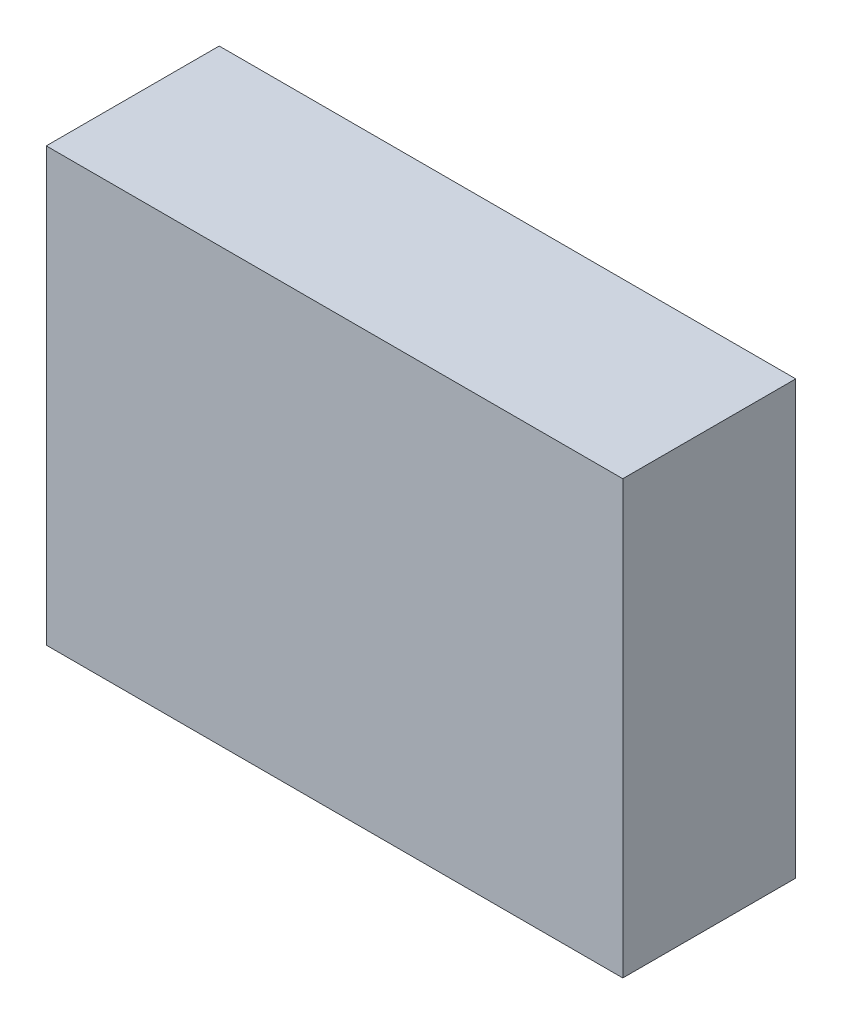
ISO-10303-21;
HEADER;
FILE_DESCRIPTION(('STEP AP214'),'2;1');
FILE_NAME('part.step','',(''),(''),'','','');
FILE_SCHEMA(('AUTOMOTIVE_DESIGN { 1 0 10303 214 1 1 1 1 }'));
ENDSEC;
DATA;
#1=APPLICATION_CONTEXT('core data for automotive mechanical design processes');
#2=APPLICATION_PROTOCOL_DEFINITION('international standard','automotive_design',2000,#1);
#3=PRODUCT_CONTEXT('',#1,'mechanical');
#4=PRODUCT('Part','Part','',(#3));
#5=PRODUCT_RELATED_PRODUCT_CATEGORY('part','',(#4));
#6=PRODUCT_DEFINITION_FORMATION('','',#4);
#7=PRODUCT_DEFINITION_CONTEXT('part definition',#1,'design');
#8=PRODUCT_DEFINITION('design','',#6,#7);
#9=PRODUCT_DEFINITION_SHAPE('','',#8);
#10=(LENGTH_UNIT() NAMED_UNIT(*) SI_UNIT(.MILLI.,.METRE.));
#11=(NAMED_UNIT(*) PLANE_ANGLE_UNIT() SI_UNIT($,.RADIAN.));
#12=(NAMED_UNIT(*) SI_UNIT($,.STERADIAN.) SOLID_ANGLE_UNIT());
#13=UNCERTAINTY_MEASURE_WITH_UNIT(LENGTH_MEASURE(1.E-05),#10,'distance_accuracy_value','');
#14=(GEOMETRIC_REPRESENTATION_CONTEXT(3) GLOBAL_UNCERTAINTY_ASSIGNED_CONTEXT((#13)) GLOBAL_UNIT_ASSIGNED_CONTEXT((#10,
#11,#12)) REPRESENTATION_CONTEXT('',''));
#15=CARTESIAN_POINT('',(0.,0.,0.));
#16=DIRECTION('',(0.,0.,1.));
#17=DIRECTION('',(1.,0.,0.));
#18=AXIS2_PLACEMENT_3D('',#15,#16,#17);
#19=CARTESIAN_POINT('',(9.99999999999999,7.5,3.));
#20=DIRECTION('',(-1.,0.,0.));
#21=DIRECTION('',(0.,-1.,0.));
#22=AXIS2_PLACEMENT_3D('',#19,#20,#21);
#23=PLANE('',#22);
#24=DIRECTION('',(0.,1.,0.));
#25=VECTOR('',#24,1.);
#26=CARTESIAN_POINT('',(9.99999999999999,7.5,-3.));
#27=LINE('',#26,#25);
#28=CARTESIAN_POINT('',(10.,-7.5,-3.));
#29=VERTEX_POINT('',#28);
#30=CARTESIAN_POINT('',(9.99999999999999,7.5,-3.));
#31=VERTEX_POINT('',#30);
#32=EDGE_CURVE('E100',#29,#31,#27,.T.);
#33=ORIENTED_EDGE('',*,*,#32,.T.);
#34=DIRECTION('',(0.,0.,-1.));
#35=VECTOR('',#34,1.);
#36=CARTESIAN_POINT('',(9.99999999999999,7.5,3.));
#37=LINE('',#36,#35);
#38=CARTESIAN_POINT('',(9.99999999999999,7.5,3.));
#39=VERTEX_POINT('',#38);
#40=EDGE_CURVE('E11',#39,#31,#37,.T.);
#41=ORIENTED_EDGE('',*,*,#40,.F.);
#42=DIRECTION('',(0.,1.,0.));
#43=VECTOR('',#42,1.);
#44=CARTESIAN_POINT('',(9.99999999999999,7.5,3.));
#45=LINE('',#44,#43);
#46=CARTESIAN_POINT('',(10.,-7.5,3.));
#47=VERTEX_POINT('',#46);
#48=EDGE_CURVE('E88',#47,#39,#45,.T.);
#49=ORIENTED_EDGE('',*,*,#48,.F.);
#50=DIRECTION('',(0.,0.,-1.));
#51=VECTOR('',#50,1.);
#52=CARTESIAN_POINT('',(10.,-7.5,3.));
#53=LINE('',#52,#51);
#54=EDGE_CURVE('E96',#47,#29,#53,.T.);
#55=ORIENTED_EDGE('',*,*,#54,.T.);
#56=EDGE_LOOP('',(#33,#41,#49,#55));
#57=FACE_BOUND('',#56,.T.);
#58=ADVANCED_FACE('F37',(#57),#23,.F.);
#59=CARTESIAN_POINT('',(-10.,7.5,3.));
#60=DIRECTION('',(0.,-1.,0.));
#61=DIRECTION('',(0.,0.,-1.));
#62=AXIS2_PLACEMENT_3D('',#59,#60,#61);
#63=PLANE('',#62);
#64=DIRECTION('',(-1.,0.,0.));
#65=VECTOR('',#64,1.);
#66=CARTESIAN_POINT('',(-10.,7.5,-3.));
#67=LINE('',#66,#65);
#68=CARTESIAN_POINT('',(-10.,7.5,-3.));
#69=VERTEX_POINT('',#68);
#70=EDGE_CURVE('E92',#31,#69,#67,.T.);
#71=ORIENTED_EDGE('',*,*,#70,.T.);
#72=DIRECTION('',(0.,0.,-1.));
#73=VECTOR('',#72,1.);
#74=CARTESIAN_POINT('',(-10.,7.5,3.));
#75=LINE('',#74,#73);
#76=CARTESIAN_POINT('',(-10.,7.5,3.));
#77=VERTEX_POINT('',#76);
#78=EDGE_CURVE('E45',#77,#69,#75,.T.);
#79=ORIENTED_EDGE('',*,*,#78,.F.);
#80=DIRECTION('',(-1.,0.,0.));
#81=VECTOR('',#80,1.);
#82=CARTESIAN_POINT('',(-10.,7.5,3.));
#83=LINE('',#82,#81);
#84=EDGE_CURVE('E83',#39,#77,#83,.T.);
#85=ORIENTED_EDGE('',*,*,#84,.F.);
#86=ORIENTED_EDGE('',*,*,#40,.T.);
#87=EDGE_LOOP('',(#71,#79,#85,#86));
#88=FACE_BOUND('',#87,.T.);
#89=ADVANCED_FACE('F91',(#88),#63,.F.);
#90=CARTESIAN_POINT('',(-10.,7.5,3.));
#91=DIRECTION('',(1.,0.,0.));
#92=DIRECTION('',(0.,0.,-1.));
#93=AXIS2_PLACEMENT_3D('',#90,#91,#92);
#94=PLANE('',#93);
#95=DIRECTION('',(0.,-1.,0.));
#96=VECTOR('',#95,1.);
#97=CARTESIAN_POINT('',(-10.,7.5,-3.));
#98=LINE('',#97,#96);
#99=CARTESIAN_POINT('',(-10.,-7.5,-3.));
#100=VERTEX_POINT('',#99);
#101=EDGE_CURVE('E70',#69,#100,#98,.T.);
#102=ORIENTED_EDGE('',*,*,#101,.T.);
#103=DIRECTION('',(0.,0.,-1.));
#104=VECTOR('',#103,1.);
#105=CARTESIAN_POINT('',(-10.,-7.5,3.));
#106=LINE('',#105,#104);
#107=CARTESIAN_POINT('',(-10.,-7.5,3.));
#108=VERTEX_POINT('',#107);
#109=EDGE_CURVE('E93',#108,#100,#106,.T.);
#110=ORIENTED_EDGE('',*,*,#109,.F.);
#111=DIRECTION('',(0.,-1.,0.));
#112=VECTOR('',#111,1.);
#113=CARTESIAN_POINT('',(-10.,7.5,3.));
#114=LINE('',#113,#112);
#115=EDGE_CURVE('E86',#77,#108,#114,.T.);
#116=ORIENTED_EDGE('',*,*,#115,.F.);
#117=ORIENTED_EDGE('',*,*,#78,.T.);
#118=EDGE_LOOP('',(#102,#110,#116,#117));
#119=FACE_BOUND('',#118,.T.);
#120=ADVANCED_FACE('F94',(#119),#94,.F.);
#121=CARTESIAN_POINT('',(-10.,-7.5,3.));
#122=DIRECTION('',(0.,1.,0.));
#123=DIRECTION('',(0.,0.,1.));
#124=AXIS2_PLACEMENT_3D('',#121,#122,#123);
#125=PLANE('',#124);
#126=DIRECTION('',(1.,0.,0.));
#127=VECTOR('',#126,1.);
#128=CARTESIAN_POINT('',(-10.,-7.5,-3.));
#129=LINE('',#128,#127);
#130=EDGE_CURVE('E76',#100,#29,#129,.T.);
#131=ORIENTED_EDGE('',*,*,#130,.T.);
#132=ORIENTED_EDGE('',*,*,#54,.F.);
#133=DIRECTION('',(1.,0.,0.));
#134=VECTOR('',#133,1.);
#135=CARTESIAN_POINT('',(-10.,-7.5,3.));
#136=LINE('',#135,#134);
#137=EDGE_CURVE('E53',#108,#47,#136,.T.);
#138=ORIENTED_EDGE('',*,*,#137,.F.);
#139=ORIENTED_EDGE('',*,*,#109,.T.);
#140=EDGE_LOOP('',(#131,#132,#138,#139));
#141=FACE_BOUND('',#140,.T.);
#142=ADVANCED_FACE('F107',(#141),#125,.F.);
#143=CARTESIAN_POINT('',(0.,0.,3.));
#144=DIRECTION('',(0.,0.,1.));
#145=DIRECTION('',(1.,0.,0.));
#146=AXIS2_PLACEMENT_3D('',#143,#144,#145);
#147=PLANE('',#146);
#148=ORIENTED_EDGE('',*,*,#48,.T.);
#149=ORIENTED_EDGE('',*,*,#84,.T.);
#150=ORIENTED_EDGE('',*,*,#115,.T.);
#151=ORIENTED_EDGE('',*,*,#137,.T.);
#152=EDGE_LOOP('',(#148,#149,#150,#151));
#153=FACE_BOUND('',#152,.T.);
#154=ADVANCED_FACE('F84',(#153),#147,.T.);
#155=CARTESIAN_POINT('',(0.,0.,-3.));
#156=DIRECTION('',(0.,0.,1.));
#157=DIRECTION('',(1.,0.,0.));
#158=AXIS2_PLACEMENT_3D('',#155,#156,#157);
#159=PLANE('',#158);
#160=ORIENTED_EDGE('',*,*,#32,.F.);
#161=ORIENTED_EDGE('',*,*,#130,.F.);
#162=ORIENTED_EDGE('',*,*,#101,.F.);
#163=ORIENTED_EDGE('',*,*,#70,.F.);
#164=EDGE_LOOP('',(#160,#161,#162,#163));
#165=FACE_BOUND('',#164,.T.);
#166=ADVANCED_FACE('F110',(#165),#159,.F.);
#167=CLOSED_SHELL('',(#58,#89,#120,#142,#154,#166));
#168=MANIFOLD_SOLID_BREP('B2',#167);
#169=ADVANCED_BREP_SHAPE_REPRESENTATION('',(#18,#168),#14);
#170=SHAPE_DEFINITION_REPRESENTATION(#9,#169);
ENDSEC;
END-ISO-10303-21;
